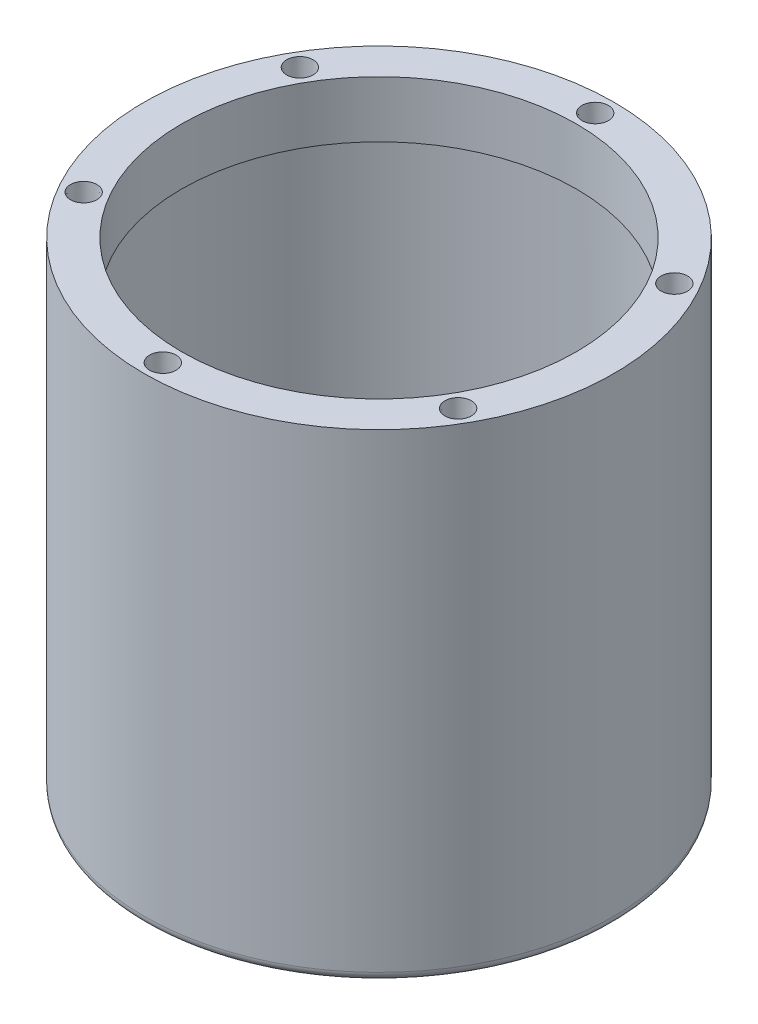
ISO-10303-21;
HEADER;
FILE_DESCRIPTION(('STEP AP214'),'2;1');
FILE_NAME('part.step','',(''),(''),'','','');
FILE_SCHEMA(('AUTOMOTIVE_DESIGN { 1 0 10303 214 1 1 1 1 }'));
ENDSEC;
DATA;
#1=APPLICATION_CONTEXT('core data for automotive mechanical design processes');
#2=APPLICATION_PROTOCOL_DEFINITION('international standard','automotive_design',2000,#1);
#3=PRODUCT_CONTEXT('',#1,'mechanical');
#4=PRODUCT('Part','Part','',(#3));
#5=PRODUCT_RELATED_PRODUCT_CATEGORY('part','',(#4));
#6=PRODUCT_DEFINITION_FORMATION('','',#4);
#7=PRODUCT_DEFINITION_CONTEXT('part definition',#1,'design');
#8=PRODUCT_DEFINITION('design','',#6,#7);
#9=PRODUCT_DEFINITION_SHAPE('','',#8);
#10=(LENGTH_UNIT() NAMED_UNIT(*) SI_UNIT(.MILLI.,.METRE.));
#11=(NAMED_UNIT(*) PLANE_ANGLE_UNIT() SI_UNIT($,.RADIAN.));
#12=(NAMED_UNIT(*) SI_UNIT($,.STERADIAN.) SOLID_ANGLE_UNIT());
#13=UNCERTAINTY_MEASURE_WITH_UNIT(LENGTH_MEASURE(1.E-05),#10,'distance_accuracy_value','');
#14=(GEOMETRIC_REPRESENTATION_CONTEXT(3) GLOBAL_UNCERTAINTY_ASSIGNED_CONTEXT((#13)) GLOBAL_UNIT_ASSIGNED_CONTEXT((#10,
#11,#12)) REPRESENTATION_CONTEXT('',''));
#15=CARTESIAN_POINT('',(0.,0.,0.));
#16=DIRECTION('',(0.,0.,1.));
#17=DIRECTION('',(1.,0.,0.));
#18=AXIS2_PLACEMENT_3D('',#15,#16,#17);
#19=CARTESIAN_POINT('',(60.96,127.,0.));
#20=DIRECTION('',(0.,1.,0.));
#21=DIRECTION('',(0.,0.,1.));
#22=AXIS2_PLACEMENT_3D('',#19,#20,#21);
#23=PLANE('',#22);
#24=CARTESIAN_POINT('',(4.00790293029813E-13,127.,-58.42));
#25=DIRECTION('',(0.,1.,0.));
#26=DIRECTION('',(0.,0.,1.));
#27=AXIS2_PLACEMENT_3D('',#24,#25,#26);
#28=CIRCLE('',#27,3.5701478);
#29=CARTESIAN_POINT('',(4.00790293029813E-13,127.,-54.8498522));
#30=VERTEX_POINT('',#29);
#31=EDGE_CURVE('E362',#30,#30,#28,.T.);
#32=ORIENTED_EDGE('',*,*,#31,.F.);
#33=EDGE_LOOP('',(#32));
#34=FACE_BOUND('',#33,.T.);
#35=CARTESIAN_POINT('',(-50.5932040890868,127.,-29.2100000000002));
#36=DIRECTION('',(0.,1.,0.));
#37=DIRECTION('',(0.,0.,1.));
#38=AXIS2_PLACEMENT_3D('',#35,#36,#37);
#39=CIRCLE('',#38,3.5701478);
#40=CARTESIAN_POINT('',(-50.5932040890868,127.,-25.6398522000002));
#41=VERTEX_POINT('',#40);
#42=EDGE_CURVE('E84',#41,#41,#39,.T.);
#43=ORIENTED_EDGE('',*,*,#42,.F.);
#44=EDGE_LOOP('',(#43));
#45=FACE_BOUND('',#44,.T.);
#46=CARTESIAN_POINT('',(-50.593204089087,127.,29.2099999999999));
#47=DIRECTION('',(0.,1.,0.));
#48=DIRECTION('',(0.,0.,1.));
#49=AXIS2_PLACEMENT_3D('',#46,#47,#48);
#50=CIRCLE('',#49,3.5701478);
#51=CARTESIAN_POINT('',(-50.593204089087,127.,32.7801477999999));
#52=VERTEX_POINT('',#51);
#53=EDGE_CURVE('E108',#52,#52,#50,.T.);
#54=ORIENTED_EDGE('',*,*,#53,.F.);
#55=EDGE_LOOP('',(#54));
#56=FACE_BOUND('',#55,.T.);
#57=CARTESIAN_POINT('',(0.,127.,58.42));
#58=DIRECTION('',(0.,1.,0.));
#59=DIRECTION('',(0.,0.,1.));
#60=AXIS2_PLACEMENT_3D('',#57,#58,#59);
#61=CIRCLE('',#60,3.5701478);
#62=CARTESIAN_POINT('',(0.,127.,61.9901478));
#63=VERTEX_POINT('',#62);
#64=EDGE_CURVE('E124',#63,#63,#61,.T.);
#65=ORIENTED_EDGE('',*,*,#64,.F.);
#66=EDGE_LOOP('',(#65));
#67=FACE_BOUND('',#66,.T.);
#68=CARTESIAN_POINT('',(50.5932040890866,127.,29.2100000000006));
#69=DIRECTION('',(0.,1.,0.));
#70=DIRECTION('',(0.,0.,1.));
#71=AXIS2_PLACEMENT_3D('',#68,#69,#70);
#72=CIRCLE('',#71,3.5701478);
#73=CARTESIAN_POINT('',(50.5932040890866,127.,32.7801478000006));
#74=VERTEX_POINT('',#73);
#75=EDGE_CURVE('E140',#74,#74,#72,.T.);
#76=ORIENTED_EDGE('',*,*,#75,.F.);
#77=EDGE_LOOP('',(#76));
#78=FACE_BOUND('',#77,.T.);
#79=CARTESIAN_POINT('',(50.5932040890872,127.,-29.2099999999995));
#80=DIRECTION('',(0.,1.,0.));
#81=DIRECTION('',(0.,0.,1.));
#82=AXIS2_PLACEMENT_3D('',#79,#80,#81);
#83=CIRCLE('',#82,3.5701478);
#84=CARTESIAN_POINT('',(50.5932040890872,127.,-25.6398521999995));
#85=VERTEX_POINT('',#84);
#86=EDGE_CURVE('E156',#85,#85,#83,.T.);
#87=ORIENTED_EDGE('',*,*,#86,.F.);
#88=EDGE_LOOP('',(#87));
#89=FACE_BOUND('',#88,.T.);
#90=CARTESIAN_POINT('',(0.,127.,0.));
#91=DIRECTION('',(0.,-1.,0.));
#92=DIRECTION('',(0.,0.,-1.));
#93=AXIS2_PLACEMENT_3D('',#90,#91,#92);
#94=CIRCLE('',#93,63.5);
#95=CARTESIAN_POINT('',(0.,127.,-63.5));
#96=VERTEX_POINT('',#95);
#97=EDGE_CURVE('E54',#96,#96,#94,.T.);
#98=ORIENTED_EDGE('',*,*,#97,.F.);
#99=EDGE_LOOP('',(#98));
#100=FACE_BOUND('',#99,.T.);
#101=CARTESIAN_POINT('',(0.,127.,0.));
#102=DIRECTION('',(0.,1.,0.));
#103=DIRECTION('',(0.,0.,1.));
#104=AXIS2_PLACEMENT_3D('',#101,#102,#103);
#105=CIRCLE('',#104,53.34);
#106=CARTESIAN_POINT('',(0.,127.,53.34));
#107=VERTEX_POINT('',#106);
#108=EDGE_CURVE('E172',#107,#107,#105,.T.);
#109=ORIENTED_EDGE('',*,*,#108,.F.);
#110=EDGE_LOOP('',(#109));
#111=FACE_BOUND('',#110,.T.);
#112=ADVANCED_FACE('F45',(#34,#45,#56,#67,#78,#89,#100,#111),#23,.T.);
#113=CARTESIAN_POINT('',(0.,0.,0.));
#114=DIRECTION('',(0.,-1.,0.));
#115=DIRECTION('',(0.,0.,-1.));
#116=AXIS2_PLACEMENT_3D('',#113,#114,#115);
#117=CYLINDRICAL_SURFACE('',#116,63.5);
#118=ORIENTED_EDGE('',*,*,#97,.T.);
#119=EDGE_LOOP('',(#118));
#120=FACE_BOUND('',#119,.T.);
#121=CARTESIAN_POINT('',(0.,0.,0.));
#122=DIRECTION('',(0.,-1.,0.));
#123=DIRECTION('',(0.,0.,-1.));
#124=AXIS2_PLACEMENT_3D('',#121,#122,#123);
#125=CIRCLE('',#124,63.5);
#126=CARTESIAN_POINT('',(0.,0.,-63.5));
#127=VERTEX_POINT('',#126);
#128=EDGE_CURVE('E192',#127,#127,#125,.T.);
#129=ORIENTED_EDGE('',*,*,#128,.F.);
#130=EDGE_LOOP('',(#129));
#131=FACE_BOUND('',#130,.T.);
#132=ADVANCED_FACE('F199',(#120,#131),#117,.T.);
#133=CARTESIAN_POINT('',(0.,0.,0.));
#134=DIRECTION('',(0.,-1.,0.));
#135=DIRECTION('',(0.,0.,-1.));
#136=AXIS2_PLACEMENT_3D('',#133,#134,#135);
#137=TOROIDAL_SURFACE('',#136,60.96,2.54);
#138=ORIENTED_EDGE('',*,*,#128,.T.);
#139=EDGE_LOOP('',(#138));
#140=FACE_BOUND('',#139,.T.);
#141=CARTESIAN_POINT('',(0.,-2.53999999999998,0.));
#142=DIRECTION('',(0.,-1.,0.));
#143=DIRECTION('',(0.,0.,-1.));
#144=AXIS2_PLACEMENT_3D('',#141,#142,#143);
#145=CIRCLE('',#144,60.96);
#146=CARTESIAN_POINT('',(0.,-2.53999999999998,-60.96));
#147=VERTEX_POINT('',#146);
#148=EDGE_CURVE('E188',#147,#147,#145,.T.);
#149=ORIENTED_EDGE('',*,*,#148,.F.);
#150=EDGE_LOOP('',(#149));
#151=FACE_BOUND('',#150,.T.);
#152=ADVANCED_FACE('F234',(#140,#151),#137,.T.);
#153=CARTESIAN_POINT('',(0.,0.,0.));
#154=DIRECTION('',(0.,-1.,0.));
#155=DIRECTION('',(0.,0.,-1.));
#156=AXIS2_PLACEMENT_3D('',#153,#154,#155);
#157=CYLINDRICAL_SURFACE('',#156,60.96);
#158=ORIENTED_EDGE('',*,*,#148,.T.);
#159=EDGE_LOOP('',(#158));
#160=FACE_BOUND('',#159,.T.);
#161=CARTESIAN_POINT('',(0.,0.,0.));
#162=DIRECTION('',(0.,-1.,0.));
#163=DIRECTION('',(0.,0.,-1.));
#164=AXIS2_PLACEMENT_3D('',#161,#162,#163);
#165=CIRCLE('',#164,60.96);
#166=CARTESIAN_POINT('',(0.,0.,-60.96));
#167=VERTEX_POINT('',#166);
#168=EDGE_CURVE('E184',#167,#167,#165,.T.);
#169=ORIENTED_EDGE('',*,*,#168,.F.);
#170=EDGE_LOOP('',(#169));
#171=FACE_BOUND('',#170,.T.);
#172=ADVANCED_FACE('F230',(#160,#171),#157,.F.);
#173=CARTESIAN_POINT('',(0.,0.,0.));
#174=DIRECTION('',(0.,-1.,0.));
#175=DIRECTION('',(0.,0.,-1.));
#176=AXIS2_PLACEMENT_3D('',#173,#174,#175);
#177=PLANE('',#176);
#178=CARTESIAN_POINT('',(0.,0.,0.));
#179=DIRECTION('',(0.,-1.,0.));
#180=DIRECTION('',(0.,0.,-1.));
#181=AXIS2_PLACEMENT_3D('',#178,#179,#180);
#182=CIRCLE('',#181,25.4);
#183=CARTESIAN_POINT('',(0.,0.,-25.4));
#184=VERTEX_POINT('',#183);
#185=EDGE_CURVE('E358',#184,#184,#182,.T.);
#186=ORIENTED_EDGE('',*,*,#185,.F.);
#187=EDGE_LOOP('',(#186));
#188=FACE_BOUND('',#187,.T.);
#189=ORIENTED_EDGE('',*,*,#168,.T.);
#190=EDGE_LOOP('',(#189));
#191=FACE_BOUND('',#190,.T.);
#192=ADVANCED_FACE('F220',(#188,#191),#177,.T.);
#193=CARTESIAN_POINT('',(0.,111.76,0.));
#194=DIRECTION('',(0.,1.,0.));
#195=DIRECTION('',(0.,0.,1.));
#196=AXIS2_PLACEMENT_3D('',#193,#194,#195);
#197=PLANE('',#196);
#198=CARTESIAN_POINT('',(0.,111.76,0.));
#199=DIRECTION('',(0.,1.,0.));
#200=DIRECTION('',(0.,0.,1.));
#201=AXIS2_PLACEMENT_3D('',#198,#199,#200);
#202=CIRCLE('',#201,53.34);
#203=CARTESIAN_POINT('',(0.,111.76,53.34));
#204=VERTEX_POINT('',#203);
#205=EDGE_CURVE('E173',#204,#204,#202,.T.);
#206=ORIENTED_EDGE('',*,*,#205,.T.);
#207=EDGE_LOOP('',(#206));
#208=FACE_BOUND('',#207,.T.);
#209=CARTESIAN_POINT('',(0.,111.76,0.));
#210=DIRECTION('',(0.,1.,0.));
#211=DIRECTION('',(0.,0.,1.));
#212=AXIS2_PLACEMENT_3D('',#209,#210,#211);
#213=CIRCLE('',#212,60.96);
#214=CARTESIAN_POINT('',(0.,111.76,60.96));
#215=VERTEX_POINT('',#214);
#216=EDGE_CURVE('E177',#215,#215,#213,.T.);
#217=ORIENTED_EDGE('',*,*,#216,.F.);
#218=EDGE_LOOP('',(#217));
#219=FACE_BOUND('',#218,.T.);
#220=ADVANCED_FACE('F210',(#208,#219),#197,.F.);
#221=CARTESIAN_POINT('',(0.,111.76,0.));
#222=DIRECTION('',(0.,1.,0.));
#223=DIRECTION('',(0.,0.,1.));
#224=AXIS2_PLACEMENT_3D('',#221,#222,#223);
#225=CYLINDRICAL_SURFACE('',#224,53.34);
#226=CARTESIAN_POINT('',(0.,111.76,53.34));
#227=CARTESIAN_POINT('',(0.,111.91875,53.34));
#228=CARTESIAN_POINT('',(0.,112.0775,53.34));
#229=CARTESIAN_POINT('',(0.,112.395,53.34));
#230=CARTESIAN_POINT('',(0.,112.55375,53.34));
#231=CARTESIAN_POINT('',(0.,112.87125,53.34));
#232=CARTESIAN_POINT('',(0.,113.03,53.34));
#233=CARTESIAN_POINT('',(0.,113.3475,53.34));
#234=CARTESIAN_POINT('',(0.,113.50625,53.34));
#235=CARTESIAN_POINT('',(0.,113.82375,53.34));
#236=CARTESIAN_POINT('',(0.,113.9825,53.34));
#237=CARTESIAN_POINT('',(0.,114.3,53.34));
#238=CARTESIAN_POINT('',(0.,114.45875,53.34));
#239=CARTESIAN_POINT('',(0.,114.77625,53.34));
#240=CARTESIAN_POINT('',(0.,114.935,53.34));
#241=CARTESIAN_POINT('',(0.,115.2525,53.34));
#242=CARTESIAN_POINT('',(0.,115.41125,53.34));
#243=CARTESIAN_POINT('',(0.,115.72875,53.34));
#244=CARTESIAN_POINT('',(0.,115.8875,53.34));
#245=CARTESIAN_POINT('',(0.,116.205,53.34));
#246=CARTESIAN_POINT('',(0.,116.36375,53.34));
#247=CARTESIAN_POINT('',(0.,116.68125,53.34));
#248=CARTESIAN_POINT('',(0.,116.84,53.34));
#249=CARTESIAN_POINT('',(0.,117.1575,53.34));
#250=CARTESIAN_POINT('',(0.,117.31625,53.34));
#251=CARTESIAN_POINT('',(0.,117.63375,53.34));
#252=CARTESIAN_POINT('',(0.,117.7925,53.34));
#253=CARTESIAN_POINT('',(0.,118.11,53.34));
#254=CARTESIAN_POINT('',(0.,118.26875,53.34));
#255=CARTESIAN_POINT('',(0.,118.58625,53.34));
#256=CARTESIAN_POINT('',(0.,118.745,53.34));
#257=CARTESIAN_POINT('',(0.,119.0625,53.34));
#258=CARTESIAN_POINT('',(0.,119.22125,53.34));
#259=CARTESIAN_POINT('',(0.,119.53875,53.34));
#260=CARTESIAN_POINT('',(0.,119.6975,53.34));
#261=CARTESIAN_POINT('',(0.,120.015,53.34));
#262=CARTESIAN_POINT('',(0.,120.17375,53.34));
#263=CARTESIAN_POINT('',(0.,120.49125,53.34));
#264=CARTESIAN_POINT('',(0.,120.65,53.34));
#265=CARTESIAN_POINT('',(0.,120.9675,53.34));
#266=CARTESIAN_POINT('',(0.,121.12625,53.34));
#267=CARTESIAN_POINT('',(0.,121.44375,53.34));
#268=CARTESIAN_POINT('',(0.,121.6025,53.34));
#269=CARTESIAN_POINT('',(0.,121.92,53.34));
#270=CARTESIAN_POINT('',(0.,122.07875,53.34));
#271=CARTESIAN_POINT('',(0.,122.39625,53.34));
#272=CARTESIAN_POINT('',(0.,122.555,53.34));
#273=CARTESIAN_POINT('',(0.,122.8725,53.34));
#274=CARTESIAN_POINT('',(0.,123.03125,53.34));
#275=CARTESIAN_POINT('',(0.,123.34875,53.34));
#276=CARTESIAN_POINT('',(0.,123.5075,53.34));
#277=CARTESIAN_POINT('',(0.,123.825,53.34));
#278=CARTESIAN_POINT('',(0.,123.98375,53.34));
#279=CARTESIAN_POINT('',(0.,124.30125,53.34));
#280=CARTESIAN_POINT('',(0.,124.46,53.34));
#281=CARTESIAN_POINT('',(0.,124.7775,53.34));
#282=CARTESIAN_POINT('',(0.,124.93625,53.34));
#283=CARTESIAN_POINT('',(0.,125.25375,53.34));
#284=CARTESIAN_POINT('',(0.,125.4125,53.34));
#285=CARTESIAN_POINT('',(0.,125.73,53.34));
#286=CARTESIAN_POINT('',(0.,125.88875,53.34));
#287=CARTESIAN_POINT('',(0.,126.20625,53.34));
#288=CARTESIAN_POINT('',(0.,126.365,53.34));
#289=CARTESIAN_POINT('',(0.,126.6825,53.34));
#290=CARTESIAN_POINT('',(0.,126.84125,53.34));
#291=CARTESIAN_POINT('',(0.,127.,53.34));
#292=B_SPLINE_CURVE_WITH_KNOTS('',3,(#226,#227,#228,#229,#230,#231,#232,#233,#234,#235,#236,
#237,#238,#239,#240,#241,#242,#243,#244,#245,#246,#247,#248,#249,#250,#251,#252,#253,#254,#255,
#256,#257,#258,#259,#260,#261,#262,#263,#264,#265,#266,#267,#268,#269,#270,#271,#272,#273,#274,
#275,#276,#277,#278,#279,#280,#281,#282,#283,#284,#285,#286,#287,#288,#289,#290,#291),
.UNSPECIFIED.,.F.,.F.,(4,2,2,2,2,2,2,2,2,2,2,2,2,2,2,2,2,2,2,2,2,2,2,2,2,2,2,2,2,2,2,2,4),(0.,
0.476249999999998,0.952499999999995,1.42874999999999,1.90499999999999,2.38124999999999,
2.85749999999998,3.33375,3.80999999999999,4.28624999999999,4.76249999999999,5.23874999999999,
5.715,6.19125,6.66749999999999,7.14374999999999,7.61999999999999,8.09624999999999,
8.57249999999998,9.04874999999999,9.52499999999999,10.00125,10.4775,10.95375,11.43,11.90625,
12.3825,12.85875,13.335,13.81125,14.2875,14.76375,15.24),.UNSPECIFIED.);
#293=EDGE_CURVE('BSEAM208',#204,#107,#292,.T.);
#294=ORIENTED_EDGE('',*,*,#205,.F.);
#295=ORIENTED_EDGE('',*,*,#108,.T.);
#296=ORIENTED_EDGE('',*,*,#293,.T.);
#297=ORIENTED_EDGE('',*,*,#293,.F.);
#298=EDGE_LOOP('',(#294,#296,#295,#297));
#299=FACE_BOUND('',#298,.T.);
#300=ADVANCED_FACE('F208',(#299),#225,.F.);
#301=CARTESIAN_POINT('',(0.,2.54,0.));
#302=DIRECTION('',(0.,1.,0.));
#303=DIRECTION('',(0.,0.,1.));
#304=AXIS2_PLACEMENT_3D('',#301,#302,#303);
#305=PLANE('',#304);
#306=CARTESIAN_POINT('',(0.,2.54,0.));
#307=DIRECTION('',(0.,-1.,0.));
#308=DIRECTION('',(0.,0.,-1.));
#309=AXIS2_PLACEMENT_3D('',#306,#307,#308);
#310=CIRCLE('',#309,25.4);
#311=CARTESIAN_POINT('',(0.,2.54,-25.4));
#312=VERTEX_POINT('',#311);
#313=EDGE_CURVE('E355',#312,#312,#310,.T.);
#314=ORIENTED_EDGE('',*,*,#313,.T.);
#315=EDGE_LOOP('',(#314));
#316=FACE_BOUND('',#315,.T.);
#317=CARTESIAN_POINT('',(0.,2.54,0.));
#318=DIRECTION('',(0.,-1.,0.));
#319=DIRECTION('',(0.,0.,-1.));
#320=AXIS2_PLACEMENT_3D('',#317,#318,#319);
#321=CIRCLE('',#320,60.96);
#322=CARTESIAN_POINT('',(0.,2.54,-60.96));
#323=VERTEX_POINT('',#322);
#324=EDGE_CURVE('E11',#323,#323,#321,.T.);
#325=ORIENTED_EDGE('',*,*,#324,.F.);
#326=EDGE_LOOP('',(#325));
#327=FACE_BOUND('',#326,.T.);
#328=ADVANCED_FACE('F47',(#316,#327),#305,.T.);
#329=CARTESIAN_POINT('',(0.,0.,0.));
#330=DIRECTION('',(0.,-1.,0.));
#331=DIRECTION('',(0.,0.,-1.));
#332=AXIS2_PLACEMENT_3D('',#329,#330,#331);
#333=CYLINDRICAL_SURFACE('',#332,60.96);
#334=ORIENTED_EDGE('',*,*,#324,.T.);
#335=EDGE_LOOP('',(#334));
#336=FACE_BOUND('',#335,.T.);
#337=ORIENTED_EDGE('',*,*,#216,.T.);
#338=EDGE_LOOP('',(#337));
#339=FACE_BOUND('',#338,.T.);
#340=ADVANCED_FACE('F218',(#336,#339),#333,.F.);
#341=CARTESIAN_POINT('',(50.5932040890872,115.316,-29.2099999999995));
#342=DIRECTION('',(0.,1.,0.));
#343=DIRECTION('',(0.,0.,1.));
#344=AXIS2_PLACEMENT_3D('',#341,#342,#343);
#345=CONICAL_SURFACE('',#344,3.0734,1.02974425867665);
#346=CARTESIAN_POINT('',(50.5932040890872,113.469314973481,-29.2099999999995));
#347=VERTEX_POINT('',#346);
#348=VERTEX_LOOP('',#347);
#349=FACE_BOUND('',#348,.T.);
#350=CARTESIAN_POINT('',(50.5932040890872,115.316,-29.2099999999995));
#351=DIRECTION('',(0.,1.,0.));
#352=DIRECTION('',(0.,0.,1.));
#353=AXIS2_PLACEMENT_3D('',#350,#351,#352);
#354=CIRCLE('',#353,3.0734);
#355=CARTESIAN_POINT('',(50.5932040890872,115.316,-26.1365999999995));
#356=VERTEX_POINT('',#355);
#357=EDGE_CURVE('E168',#356,#356,#354,.T.);
#358=ORIENTED_EDGE('',*,*,#357,.T.);
#359=EDGE_LOOP('',(#358));
#360=FACE_BOUND('',#359,.T.);
#361=ADVANCED_FACE('F225',(#349,#360),#345,.F.);
#362=CARTESIAN_POINT('',(50.5932040890872,127.,-29.2099999999995));
#363=DIRECTION('',(0.,1.,0.));
#364=DIRECTION('',(0.,0.,1.));
#365=AXIS2_PLACEMENT_3D('',#362,#363,#364);
#366=CYLINDRICAL_SURFACE('',#365,3.0734);
#367=ORIENTED_EDGE('',*,*,#357,.F.);
#368=EDGE_LOOP('',(#367));
#369=FACE_BOUND('',#368,.T.);
#370=CARTESIAN_POINT('',(50.5932040890872,120.142,-29.2099999999995));
#371=DIRECTION('',(0.,1.,0.));
#372=DIRECTION('',(0.,0.,1.));
#373=AXIS2_PLACEMENT_3D('',#370,#371,#372);
#374=CIRCLE('',#373,3.0734);
#375=CARTESIAN_POINT('',(50.5932040890872,120.142,-26.1365999999995));
#376=VERTEX_POINT('',#375);
#377=EDGE_CURVE('E164',#376,#376,#374,.T.);
#378=ORIENTED_EDGE('',*,*,#377,.T.);
#379=EDGE_LOOP('',(#378));
#380=FACE_BOUND('',#379,.T.);
#381=ADVANCED_FACE('F245',(#369,#380),#366,.F.);
#382=CARTESIAN_POINT('',(53.6666040890872,120.142,-29.2099999999995));
#383=DIRECTION('',(0.,-1.,0.));
#384=DIRECTION('',(0.,0.,-1.));
#385=AXIS2_PLACEMENT_3D('',#382,#383,#384);
#386=PLANE('',#385);
#387=ORIENTED_EDGE('',*,*,#377,.F.);
#388=EDGE_LOOP('',(#387));
#389=FACE_BOUND('',#388,.T.);
#390=CARTESIAN_POINT('',(50.5932040890872,120.142,-29.2099999999995));
#391=DIRECTION('',(0.,1.,0.));
#392=DIRECTION('',(0.,0.,1.));
#393=AXIS2_PLACEMENT_3D('',#390,#391,#392);
#394=CIRCLE('',#393,3.36481009596849);
#395=CARTESIAN_POINT('',(50.5932040890872,120.142,-25.845189904031));
#396=VERTEX_POINT('',#395);
#397=EDGE_CURVE('E160',#396,#396,#394,.T.);
#398=ORIENTED_EDGE('',*,*,#397,.T.);
#399=EDGE_LOOP('',(#398));
#400=FACE_BOUND('',#399,.T.);
#401=ADVANCED_FACE('F254',(#389,#400),#386,.F.);
#402=CARTESIAN_POINT('',(50.5932040890872,127.,-29.2099999999995));
#403=DIRECTION('',(0.,1.,0.));
#404=DIRECTION('',(0.,0.,1.));
#405=AXIS2_PLACEMENT_3D('',#402,#403,#404);
#406=CONICAL_SURFACE('',#405,3.5701478,0.0299323966717033);
#407=ORIENTED_EDGE('',*,*,#397,.F.);
#408=EDGE_LOOP('',(#407));
#409=FACE_BOUND('',#408,.T.);
#410=ORIENTED_EDGE('',*,*,#86,.T.);
#411=EDGE_LOOP('',(#410));
#412=FACE_BOUND('',#411,.T.);
#413=ADVANCED_FACE('F263',(#409,#412),#406,.F.);
#414=CARTESIAN_POINT('',(50.5932040890866,115.316,29.2100000000006));
#415=DIRECTION('',(0.,1.,0.));
#416=DIRECTION('',(0.,0.,1.));
#417=AXIS2_PLACEMENT_3D('',#414,#415,#416);
#418=CONICAL_SURFACE('',#417,3.0734,1.02974425867665);
#419=CARTESIAN_POINT('',(50.5932040890866,113.469314973481,29.2100000000006));
#420=VERTEX_POINT('',#419);
#421=VERTEX_LOOP('',#420);
#422=FACE_BOUND('',#421,.T.);
#423=CARTESIAN_POINT('',(50.5932040890866,115.316,29.2100000000006));
#424=DIRECTION('',(0.,1.,0.));
#425=DIRECTION('',(0.,0.,1.));
#426=AXIS2_PLACEMENT_3D('',#423,#424,#425);
#427=CIRCLE('',#426,3.0734);
#428=CARTESIAN_POINT('',(50.5932040890866,115.316,32.2834000000006));
#429=VERTEX_POINT('',#428);
#430=EDGE_CURVE('E152',#429,#429,#427,.T.);
#431=ORIENTED_EDGE('',*,*,#430,.T.);
#432=EDGE_LOOP('',(#431));
#433=FACE_BOUND('',#432,.T.);
#434=ADVANCED_FACE('F269',(#422,#433),#418,.F.);
#435=CARTESIAN_POINT('',(50.5932040890866,127.,29.2100000000006));
#436=DIRECTION('',(0.,1.,0.));
#437=DIRECTION('',(0.,0.,1.));
#438=AXIS2_PLACEMENT_3D('',#435,#436,#437);
#439=CYLINDRICAL_SURFACE('',#438,3.0734);
#440=ORIENTED_EDGE('',*,*,#430,.F.);
#441=EDGE_LOOP('',(#440));
#442=FACE_BOUND('',#441,.T.);
#443=CARTESIAN_POINT('',(50.5932040890866,120.142,29.2100000000006));
#444=DIRECTION('',(0.,1.,0.));
#445=DIRECTION('',(0.,0.,1.));
#446=AXIS2_PLACEMENT_3D('',#443,#444,#445);
#447=CIRCLE('',#446,3.0734);
#448=CARTESIAN_POINT('',(50.5932040890866,120.142,32.2834000000006));
#449=VERTEX_POINT('',#448);
#450=EDGE_CURVE('E148',#449,#449,#447,.T.);
#451=ORIENTED_EDGE('',*,*,#450,.T.);
#452=EDGE_LOOP('',(#451));
#453=FACE_BOUND('',#452,.T.);
#454=ADVANCED_FACE('F276',(#442,#453),#439,.F.);
#455=CARTESIAN_POINT('',(53.6666040890866,120.142,29.2100000000006));
#456=DIRECTION('',(0.,-1.,0.));
#457=DIRECTION('',(0.,0.,-1.));
#458=AXIS2_PLACEMENT_3D('',#455,#456,#457);
#459=PLANE('',#458);
#460=ORIENTED_EDGE('',*,*,#450,.F.);
#461=EDGE_LOOP('',(#460));
#462=FACE_BOUND('',#461,.T.);
#463=CARTESIAN_POINT('',(50.5932040890866,120.142,29.2100000000006));
#464=DIRECTION('',(0.,1.,0.));
#465=DIRECTION('',(0.,0.,1.));
#466=AXIS2_PLACEMENT_3D('',#463,#464,#465);
#467=CIRCLE('',#466,3.36481009596849);
#468=CARTESIAN_POINT('',(50.5932040890866,120.142,32.5748100959691));
#469=VERTEX_POINT('',#468);
#470=EDGE_CURVE('E144',#469,#469,#467,.T.);
#471=ORIENTED_EDGE('',*,*,#470,.T.);
#472=EDGE_LOOP('',(#471));
#473=FACE_BOUND('',#472,.T.);
#474=ADVANCED_FACE('F281',(#462,#473),#459,.F.);
#475=CARTESIAN_POINT('',(50.5932040890866,127.,29.2100000000006));
#476=DIRECTION('',(0.,1.,0.));
#477=DIRECTION('',(0.,0.,1.));
#478=AXIS2_PLACEMENT_3D('',#475,#476,#477);
#479=CONICAL_SURFACE('',#478,3.5701478,0.0299323966717033);
#480=ORIENTED_EDGE('',*,*,#470,.F.);
#481=EDGE_LOOP('',(#480));
#482=FACE_BOUND('',#481,.T.);
#483=ORIENTED_EDGE('',*,*,#75,.T.);
#484=EDGE_LOOP('',(#483));
#485=FACE_BOUND('',#484,.T.);
#486=ADVANCED_FACE('F285',(#482,#485),#479,.F.);
#487=CARTESIAN_POINT('',(0.,115.316,58.42));
#488=DIRECTION('',(0.,1.,0.));
#489=DIRECTION('',(0.,0.,1.));
#490=AXIS2_PLACEMENT_3D('',#487,#488,#489);
#491=CONICAL_SURFACE('',#490,3.0734,1.02974425867665);
#492=CARTESIAN_POINT('',(0.,113.469314973481,58.42));
#493=VERTEX_POINT('',#492);
#494=VERTEX_LOOP('',#493);
#495=FACE_BOUND('',#494,.T.);
#496=CARTESIAN_POINT('',(0.,115.316,58.42));
#497=DIRECTION('',(0.,1.,0.));
#498=DIRECTION('',(0.,0.,1.));
#499=AXIS2_PLACEMENT_3D('',#496,#497,#498);
#500=CIRCLE('',#499,3.0734);
#501=CARTESIAN_POINT('',(0.,115.316,61.4934));
#502=VERTEX_POINT('',#501);
#503=EDGE_CURVE('E136',#502,#502,#500,.T.);
#504=ORIENTED_EDGE('',*,*,#503,.T.);
#505=EDGE_LOOP('',(#504));
#506=FACE_BOUND('',#505,.T.);
#507=ADVANCED_FACE('F289',(#495,#506),#491,.F.);
#508=CARTESIAN_POINT('',(0.,127.,58.42));
#509=DIRECTION('',(0.,1.,0.));
#510=DIRECTION('',(0.,0.,1.));
#511=AXIS2_PLACEMENT_3D('',#508,#509,#510);
#512=CYLINDRICAL_SURFACE('',#511,3.0734);
#513=ORIENTED_EDGE('',*,*,#503,.F.);
#514=EDGE_LOOP('',(#513));
#515=FACE_BOUND('',#514,.T.);
#516=CARTESIAN_POINT('',(0.,120.142,58.42));
#517=DIRECTION('',(0.,1.,0.));
#518=DIRECTION('',(0.,0.,1.));
#519=AXIS2_PLACEMENT_3D('',#516,#517,#518);
#520=CIRCLE('',#519,3.0734);
#521=CARTESIAN_POINT('',(0.,120.142,61.4934));
#522=VERTEX_POINT('',#521);
#523=EDGE_CURVE('E132',#522,#522,#520,.T.);
#524=ORIENTED_EDGE('',*,*,#523,.T.);
#525=EDGE_LOOP('',(#524));
#526=FACE_BOUND('',#525,.T.);
#527=ADVANCED_FACE('F293',(#515,#526),#512,.F.);
#528=CARTESIAN_POINT('',(3.07340000000001,120.142,58.42));
#529=DIRECTION('',(0.,-1.,0.));
#530=DIRECTION('',(0.,0.,-1.));
#531=AXIS2_PLACEMENT_3D('',#528,#529,#530);
#532=PLANE('',#531);
#533=ORIENTED_EDGE('',*,*,#523,.F.);
#534=EDGE_LOOP('',(#533));
#535=FACE_BOUND('',#534,.T.);
#536=CARTESIAN_POINT('',(0.,120.142,58.42));
#537=DIRECTION('',(0.,1.,0.));
#538=DIRECTION('',(0.,0.,1.));
#539=AXIS2_PLACEMENT_3D('',#536,#537,#538);
#540=CIRCLE('',#539,3.3648100959685);
#541=CARTESIAN_POINT('',(0.,120.142,61.7848100959685));
#542=VERTEX_POINT('',#541);
#543=EDGE_CURVE('E128',#542,#542,#540,.T.);
#544=ORIENTED_EDGE('',*,*,#543,.T.);
#545=EDGE_LOOP('',(#544));
#546=FACE_BOUND('',#545,.T.);
#547=ADVANCED_FACE('F297',(#535,#546),#532,.F.);
#548=CARTESIAN_POINT('',(0.,127.,58.42));
#549=DIRECTION('',(0.,1.,0.));
#550=DIRECTION('',(0.,0.,1.));
#551=AXIS2_PLACEMENT_3D('',#548,#549,#550);
#552=CONICAL_SURFACE('',#551,3.5701478,0.0299323966717028);
#553=ORIENTED_EDGE('',*,*,#543,.F.);
#554=EDGE_LOOP('',(#553));
#555=FACE_BOUND('',#554,.T.);
#556=ORIENTED_EDGE('',*,*,#64,.T.);
#557=EDGE_LOOP('',(#556));
#558=FACE_BOUND('',#557,.T.);
#559=ADVANCED_FACE('F301',(#555,#558),#552,.F.);
#560=CARTESIAN_POINT('',(-50.593204089087,115.316,29.2099999999999));
#561=DIRECTION('',(0.,1.,0.));
#562=DIRECTION('',(0.,0.,1.));
#563=AXIS2_PLACEMENT_3D('',#560,#561,#562);
#564=CONICAL_SURFACE('',#563,3.0734,1.02974425867665);
#565=CARTESIAN_POINT('',(-50.593204089087,113.469314973481,29.2099999999999));
#566=VERTEX_POINT('',#565);
#567=VERTEX_LOOP('',#566);
#568=FACE_BOUND('',#567,.T.);
#569=CARTESIAN_POINT('',(-50.593204089087,115.316,29.2099999999999));
#570=DIRECTION('',(0.,1.,0.));
#571=DIRECTION('',(0.,0.,1.));
#572=AXIS2_PLACEMENT_3D('',#569,#570,#571);
#573=CIRCLE('',#572,3.0734);
#574=CARTESIAN_POINT('',(-50.593204089087,115.316,32.2833999999999));
#575=VERTEX_POINT('',#574);
#576=EDGE_CURVE('E120',#575,#575,#573,.T.);
#577=ORIENTED_EDGE('',*,*,#576,.T.);
#578=EDGE_LOOP('',(#577));
#579=FACE_BOUND('',#578,.T.);
#580=ADVANCED_FACE('F305',(#568,#579),#564,.F.);
#581=CARTESIAN_POINT('',(-50.593204089087,127.,29.2099999999999));
#582=DIRECTION('',(0.,1.,0.));
#583=DIRECTION('',(0.,0.,1.));
#584=AXIS2_PLACEMENT_3D('',#581,#582,#583);
#585=CYLINDRICAL_SURFACE('',#584,3.0734);
#586=ORIENTED_EDGE('',*,*,#576,.F.);
#587=EDGE_LOOP('',(#586));
#588=FACE_BOUND('',#587,.T.);
#589=CARTESIAN_POINT('',(-50.593204089087,120.142,29.2099999999999));
#590=DIRECTION('',(0.,1.,0.));
#591=DIRECTION('',(0.,0.,1.));
#592=AXIS2_PLACEMENT_3D('',#589,#590,#591);
#593=CIRCLE('',#592,3.0734);
#594=CARTESIAN_POINT('',(-50.593204089087,120.142,32.2833999999999));
#595=VERTEX_POINT('',#594);
#596=EDGE_CURVE('E116',#595,#595,#593,.T.);
#597=ORIENTED_EDGE('',*,*,#596,.T.);
#598=EDGE_LOOP('',(#597));
#599=FACE_BOUND('',#598,.T.);
#600=ADVANCED_FACE('F309',(#588,#599),#585,.F.);
#601=CARTESIAN_POINT('',(-47.519804089087,120.142,29.2099999999999));
#602=DIRECTION('',(0.,-1.,0.));
#603=DIRECTION('',(0.,0.,-1.));
#604=AXIS2_PLACEMENT_3D('',#601,#602,#603);
#605=PLANE('',#604);
#606=ORIENTED_EDGE('',*,*,#596,.F.);
#607=EDGE_LOOP('',(#606));
#608=FACE_BOUND('',#607,.T.);
#609=CARTESIAN_POINT('',(-50.593204089087,120.142,29.2099999999999));
#610=DIRECTION('',(0.,1.,0.));
#611=DIRECTION('',(0.,0.,1.));
#612=AXIS2_PLACEMENT_3D('',#609,#610,#611);
#613=CIRCLE('',#612,3.3648100959685);
#614=CARTESIAN_POINT('',(-50.593204089087,120.142,32.5748100959684));
#615=VERTEX_POINT('',#614);
#616=EDGE_CURVE('E112',#615,#615,#613,.T.);
#617=ORIENTED_EDGE('',*,*,#616,.T.);
#618=EDGE_LOOP('',(#617));
#619=FACE_BOUND('',#618,.T.);
#620=ADVANCED_FACE('F313',(#608,#619),#605,.F.);
#621=CARTESIAN_POINT('',(-50.593204089087,127.,29.2099999999999));
#622=DIRECTION('',(0.,1.,0.));
#623=DIRECTION('',(0.,0.,1.));
#624=AXIS2_PLACEMENT_3D('',#621,#622,#623);
#625=CONICAL_SURFACE('',#624,3.5701478,0.0299323966717023);
#626=ORIENTED_EDGE('',*,*,#616,.F.);
#627=EDGE_LOOP('',(#626));
#628=FACE_BOUND('',#627,.T.);
#629=ORIENTED_EDGE('',*,*,#53,.T.);
#630=EDGE_LOOP('',(#629));
#631=FACE_BOUND('',#630,.T.);
#632=ADVANCED_FACE('F317',(#628,#631),#625,.F.);
#633=CARTESIAN_POINT('',(-50.5932040890868,115.316,-29.2100000000002));
#634=DIRECTION('',(0.,1.,0.));
#635=DIRECTION('',(0.,0.,1.));
#636=AXIS2_PLACEMENT_3D('',#633,#634,#635);
#637=CONICAL_SURFACE('',#636,3.0734,1.02974425867665);
#638=CARTESIAN_POINT('',(-50.5932040890868,113.469314973481,-29.2100000000002));
#639=VERTEX_POINT('',#638);
#640=VERTEX_LOOP('',#639);
#641=FACE_BOUND('',#640,.T.);
#642=CARTESIAN_POINT('',(-50.5932040890868,115.316,-29.2100000000002));
#643=DIRECTION('',(0.,1.,0.));
#644=DIRECTION('',(0.,0.,1.));
#645=AXIS2_PLACEMENT_3D('',#642,#643,#644);
#646=CIRCLE('',#645,3.0734);
#647=CARTESIAN_POINT('',(-50.5932040890868,115.316,-26.1366000000002));
#648=VERTEX_POINT('',#647);
#649=EDGE_CURVE('E104',#648,#648,#646,.T.);
#650=ORIENTED_EDGE('',*,*,#649,.T.);
#651=EDGE_LOOP('',(#650));
#652=FACE_BOUND('',#651,.T.);
#653=ADVANCED_FACE('F321',(#641,#652),#637,.F.);
#654=CARTESIAN_POINT('',(-50.5932040890868,127.,-29.2100000000002));
#655=DIRECTION('',(0.,1.,0.));
#656=DIRECTION('',(0.,0.,1.));
#657=AXIS2_PLACEMENT_3D('',#654,#655,#656);
#658=CYLINDRICAL_SURFACE('',#657,3.0734);
#659=ORIENTED_EDGE('',*,*,#649,.F.);
#660=EDGE_LOOP('',(#659));
#661=FACE_BOUND('',#660,.T.);
#662=CARTESIAN_POINT('',(-50.5932040890868,120.142,-29.2100000000002));
#663=DIRECTION('',(0.,1.,0.));
#664=DIRECTION('',(0.,0.,1.));
#665=AXIS2_PLACEMENT_3D('',#662,#663,#664);
#666=CIRCLE('',#665,3.0734);
#667=CARTESIAN_POINT('',(-50.5932040890868,120.142,-26.1366000000002));
#668=VERTEX_POINT('',#667);
#669=EDGE_CURVE('E100',#668,#668,#666,.T.);
#670=ORIENTED_EDGE('',*,*,#669,.T.);
#671=EDGE_LOOP('',(#670));
#672=FACE_BOUND('',#671,.T.);
#673=ADVANCED_FACE('F325',(#661,#672),#658,.F.);
#674=CARTESIAN_POINT('',(-47.5198040890868,120.142,-29.2100000000002));
#675=DIRECTION('',(0.,-1.,0.));
#676=DIRECTION('',(0.,0.,-1.));
#677=AXIS2_PLACEMENT_3D('',#674,#675,#676);
#678=PLANE('',#677);
#679=ORIENTED_EDGE('',*,*,#669,.F.);
#680=EDGE_LOOP('',(#679));
#681=FACE_BOUND('',#680,.T.);
#682=CARTESIAN_POINT('',(-50.5932040890868,120.142,-29.2100000000002));
#683=DIRECTION('',(0.,1.,0.));
#684=DIRECTION('',(0.,0.,1.));
#685=AXIS2_PLACEMENT_3D('',#682,#683,#684);
#686=CIRCLE('',#685,3.3648100959685);
#687=CARTESIAN_POINT('',(-50.5932040890868,120.142,-25.8451899040317));
#688=VERTEX_POINT('',#687);
#689=EDGE_CURVE('E90',#688,#688,#686,.T.);
#690=ORIENTED_EDGE('',*,*,#689,.T.);
#691=EDGE_LOOP('',(#690));
#692=FACE_BOUND('',#691,.T.);
#693=ADVANCED_FACE('F329',(#681,#692),#678,.F.);
#694=CARTESIAN_POINT('',(-50.5932040890868,127.,-29.2100000000002));
#695=DIRECTION('',(0.,1.,0.));
#696=DIRECTION('',(0.,0.,1.));
#697=AXIS2_PLACEMENT_3D('',#694,#695,#696);
#698=CONICAL_SURFACE('',#697,3.5701478,0.0299323966717023);
#699=ORIENTED_EDGE('',*,*,#689,.F.);
#700=EDGE_LOOP('',(#699));
#701=FACE_BOUND('',#700,.T.);
#702=ORIENTED_EDGE('',*,*,#42,.T.);
#703=EDGE_LOOP('',(#702));
#704=FACE_BOUND('',#703,.T.);
#705=ADVANCED_FACE('F77',(#701,#704),#698,.F.);
#706=CARTESIAN_POINT('',(4.00790293029813E-13,115.316,-58.42));
#707=DIRECTION('',(0.,1.,0.));
#708=DIRECTION('',(0.,0.,1.));
#709=AXIS2_PLACEMENT_3D('',#706,#707,#708);
#710=CONICAL_SURFACE('',#709,3.0734,1.02974425867665);
#711=CARTESIAN_POINT('',(4.00790293029813E-13,113.469314973481,-58.42));
#712=VERTEX_POINT('',#711);
#713=VERTEX_LOOP('',#712);
#714=FACE_BOUND('',#713,.T.);
#715=CARTESIAN_POINT('',(4.00790293029813E-13,115.316,-58.42));
#716=DIRECTION('',(0.,1.,0.));
#717=DIRECTION('',(0.,0.,1.));
#718=AXIS2_PLACEMENT_3D('',#715,#716,#717);
#719=CIRCLE('',#718,3.0734);
#720=CARTESIAN_POINT('',(4.00790293029813E-13,115.316,-55.3466));
#721=VERTEX_POINT('',#720);
#722=EDGE_CURVE('E81',#721,#721,#719,.T.);
#723=ORIENTED_EDGE('',*,*,#722,.T.);
#724=EDGE_LOOP('',(#723));
#725=FACE_BOUND('',#724,.T.);
#726=ADVANCED_FACE('F73',(#714,#725),#710,.F.);
#727=CARTESIAN_POINT('',(4.00790293029813E-13,127.,-58.42));
#728=DIRECTION('',(0.,1.,0.));
#729=DIRECTION('',(0.,0.,1.));
#730=AXIS2_PLACEMENT_3D('',#727,#728,#729);
#731=CYLINDRICAL_SURFACE('',#730,3.0734);
#732=ORIENTED_EDGE('',*,*,#722,.F.);
#733=EDGE_LOOP('',(#732));
#734=FACE_BOUND('',#733,.T.);
#735=CARTESIAN_POINT('',(4.00790293029813E-13,120.142,-58.42));
#736=DIRECTION('',(0.,1.,0.));
#737=DIRECTION('',(0.,0.,1.));
#738=AXIS2_PLACEMENT_3D('',#735,#736,#737);
#739=CIRCLE('',#738,3.0734);
#740=CARTESIAN_POINT('',(4.00790293029813E-13,120.142,-55.3466));
#741=VERTEX_POINT('',#740);
#742=EDGE_CURVE('E85',#741,#741,#739,.T.);
#743=ORIENTED_EDGE('',*,*,#742,.T.);
#744=EDGE_LOOP('',(#743));
#745=FACE_BOUND('',#744,.T.);
#746=ADVANCED_FACE('F76',(#734,#745),#731,.F.);
#747=CARTESIAN_POINT('',(3.0734000000004,120.142,-58.42));
#748=DIRECTION('',(0.,-1.,0.));
#749=DIRECTION('',(0.,0.,-1.));
#750=AXIS2_PLACEMENT_3D('',#747,#748,#749);
#751=PLANE('',#750);
#752=ORIENTED_EDGE('',*,*,#742,.F.);
#753=EDGE_LOOP('',(#752));
#754=FACE_BOUND('',#753,.T.);
#755=CARTESIAN_POINT('',(4.00790293029813E-13,120.142,-58.42));
#756=DIRECTION('',(0.,1.,0.));
#757=DIRECTION('',(0.,0.,1.));
#758=AXIS2_PLACEMENT_3D('',#755,#756,#757);
#759=CIRCLE('',#758,3.3648100959685);
#760=CARTESIAN_POINT('',(4.00790293029813E-13,120.142,-55.0551899040315));
#761=VERTEX_POINT('',#760);
#762=EDGE_CURVE('E93',#761,#761,#759,.T.);
#763=ORIENTED_EDGE('',*,*,#762,.T.);
#764=EDGE_LOOP('',(#763));
#765=FACE_BOUND('',#764,.T.);
#766=ADVANCED_FACE('F339',(#754,#765),#751,.F.);
#767=CARTESIAN_POINT('',(4.00790293029813E-13,127.,-58.42));
#768=DIRECTION('',(0.,1.,0.));
#769=DIRECTION('',(0.,0.,1.));
#770=AXIS2_PLACEMENT_3D('',#767,#768,#769);
#771=CONICAL_SURFACE('',#770,3.5701478,0.0299323966717028);
#772=ORIENTED_EDGE('',*,*,#762,.F.);
#773=EDGE_LOOP('',(#772));
#774=FACE_BOUND('',#773,.T.);
#775=ORIENTED_EDGE('',*,*,#31,.T.);
#776=EDGE_LOOP('',(#775));
#777=FACE_BOUND('',#776,.T.);
#778=ADVANCED_FACE('F342',(#774,#777),#771,.F.);
#779=CARTESIAN_POINT('',(0.,2.54,0.));
#780=DIRECTION('',(0.,-1.,0.));
#781=DIRECTION('',(0.,0.,-1.));
#782=AXIS2_PLACEMENT_3D('',#779,#780,#781);
#783=CYLINDRICAL_SURFACE('',#782,25.4);
#784=ORIENTED_EDGE('',*,*,#313,.F.);
#785=EDGE_LOOP('',(#784));
#786=FACE_BOUND('',#785,.T.);
#787=ORIENTED_EDGE('',*,*,#185,.T.);
#788=EDGE_LOOP('',(#787));
#789=FACE_BOUND('',#788,.T.);
#790=ADVANCED_FACE('F346',(#786,#789),#783,.F.);
#791=CLOSED_SHELL('',(#112,#132,#152,#172,#192,#220,#300,#328,#340,#361,#381,#401,#413,#434,
#454,#474,#486,#507,#527,#547,#559,#580,#600,#620,#632,#653,#673,#693,#705,#726,#746,#766,#778,#790));
#792=MANIFOLD_SOLID_BREP('B2',#791);
#793=ADVANCED_BREP_SHAPE_REPRESENTATION('',(#18,#792),#14);
#794=SHAPE_DEFINITION_REPRESENTATION(#9,#793);
ENDSEC;
END-ISO-10303-21;
